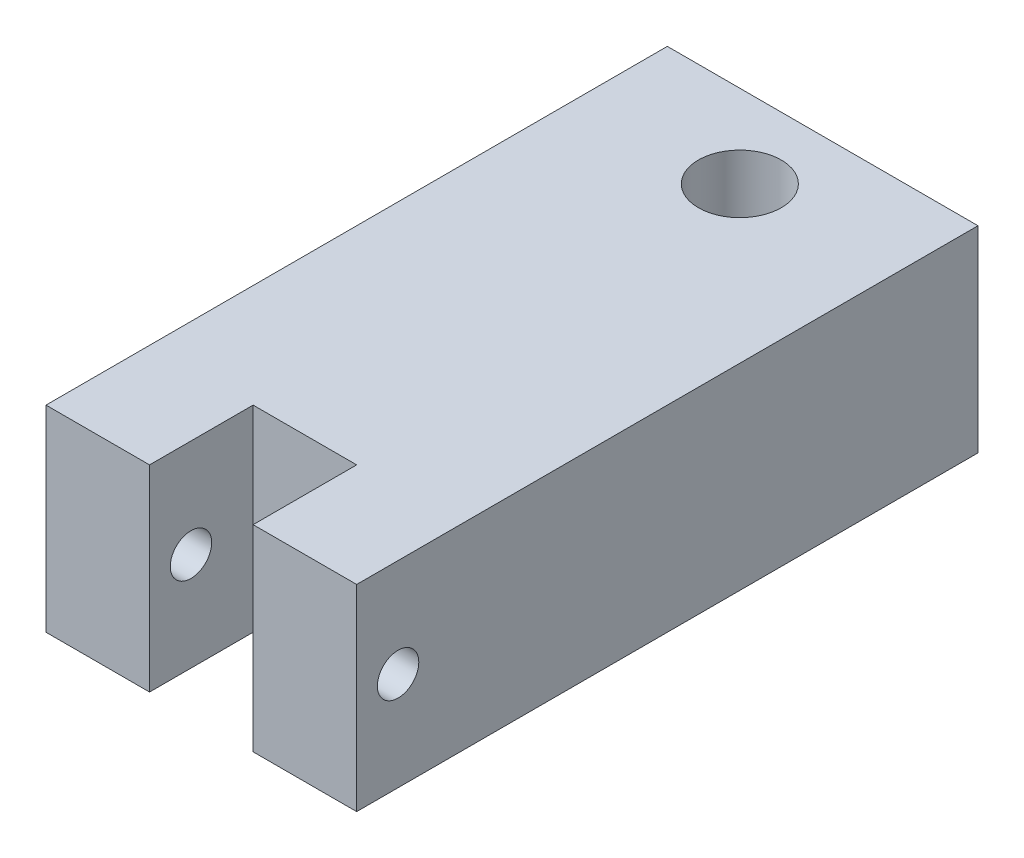
ISO-10303-21;
HEADER;
FILE_DESCRIPTION(('STEP AP214'),'2;1');
FILE_NAME('part.step','',(''),(''),'','','');
FILE_SCHEMA(('AUTOMOTIVE_DESIGN { 1 0 10303 214 1 1 1 1 }'));
ENDSEC;
DATA;
#1=APPLICATION_CONTEXT('core data for automotive mechanical design processes');
#2=APPLICATION_PROTOCOL_DEFINITION('international standard','automotive_design',2000,#1);
#3=PRODUCT_CONTEXT('',#1,'mechanical');
#4=PRODUCT('Part','Part','',(#3));
#5=PRODUCT_RELATED_PRODUCT_CATEGORY('part','',(#4));
#6=PRODUCT_DEFINITION_FORMATION('','',#4);
#7=PRODUCT_DEFINITION_CONTEXT('part definition',#1,'design');
#8=PRODUCT_DEFINITION('design','',#6,#7);
#9=PRODUCT_DEFINITION_SHAPE('','',#8);
#10=(LENGTH_UNIT() NAMED_UNIT(*) SI_UNIT(.MILLI.,.METRE.));
#11=(NAMED_UNIT(*) PLANE_ANGLE_UNIT() SI_UNIT($,.RADIAN.));
#12=(NAMED_UNIT(*) SI_UNIT($,.STERADIAN.) SOLID_ANGLE_UNIT());
#13=UNCERTAINTY_MEASURE_WITH_UNIT(LENGTH_MEASURE(1.E-05),#10,'distance_accuracy_value','');
#14=(GEOMETRIC_REPRESENTATION_CONTEXT(3) GLOBAL_UNCERTAINTY_ASSIGNED_CONTEXT((#13)) GLOBAL_UNIT_ASSIGNED_CONTEXT((#10,
#11,#12)) REPRESENTATION_CONTEXT('',''));
#15=CARTESIAN_POINT('',(0.,0.,0.));
#16=DIRECTION('',(0.,0.,1.));
#17=DIRECTION('',(1.,0.,0.));
#18=AXIS2_PLACEMENT_3D('',#15,#16,#17);
#19=CARTESIAN_POINT('',(22.9996017626033,83.125,157.171618794458));
#20=DIRECTION('',(0.,0.,-1.));
#21=DIRECTION('',(-1.,0.,0.));
#22=AXIS2_PLACEMENT_3D('',#19,#20,#21);
#23=PLANE('',#22);
#24=DIRECTION('',(0.,1.,0.));
#25=VECTOR('',#24,1.);
#26=CARTESIAN_POINT('',(41.7496017626034,83.2189360091688,157.171618794458));
#27=LINE('',#26,#25);
#28=CARTESIAN_POINT('',(41.7496017626034,11.875,157.171618794458));
#29=VERTEX_POINT('',#28);
#30=CARTESIAN_POINT('',(41.7496017626034,83.125,157.171618794458));
#31=VERTEX_POINT('',#30);
#32=EDGE_CURVE('E242',#29,#31,#27,.T.);
#33=ORIENTED_EDGE('',*,*,#32,.F.);
#34=DIRECTION('',(1.,0.,0.));
#35=VECTOR('',#34,1.);
#36=CARTESIAN_POINT('',(22.9996017626033,11.875,157.171618794458));
#37=LINE('',#36,#35);
#38=CARTESIAN_POINT('',(79.2496017626034,11.875,157.171618794458));
#39=VERTEX_POINT('',#38);
#40=EDGE_CURVE('E155',#29,#39,#37,.T.);
#41=ORIENTED_EDGE('',*,*,#40,.T.);
#42=DIRECTION('',(0.,-1.,0.));
#43=VECTOR('',#42,1.);
#44=CARTESIAN_POINT('',(79.2496017626034,83.125,157.171618794458));
#45=LINE('',#44,#43);
#46=CARTESIAN_POINT('',(79.2496017626034,83.125,157.171618794458));
#47=VERTEX_POINT('',#46);
#48=EDGE_CURVE('E13',#47,#39,#45,.T.);
#49=ORIENTED_EDGE('',*,*,#48,.F.);
#50=DIRECTION('',(1.,0.,0.));
#51=VECTOR('',#50,1.);
#52=CARTESIAN_POINT('',(60.4996017626033,83.125,157.171618794458));
#53=LINE('',#52,#51);
#54=EDGE_CURVE('E111',#31,#47,#53,.T.);
#55=ORIENTED_EDGE('',*,*,#54,.F.);
#56=EDGE_LOOP('',(#33,#41,#49,#55));
#57=FACE_BOUND('',#56,.T.);
#58=ADVANCED_FACE('F54',(#57),#23,.F.);
#59=DIRECTION('',(0.,-1.,0.));
#60=VECTOR('',#59,1.);
#61=CARTESIAN_POINT('',(4.24960176260337,83.2189360091688,157.171618794458));
#62=LINE('',#61,#60);
#63=CARTESIAN_POINT('',(4.24960176260337,83.125,157.171618794458));
#64=VERTEX_POINT('',#63);
#65=CARTESIAN_POINT('',(4.24960176260337,11.875,157.171618794458));
#66=VERTEX_POINT('',#65);
#67=EDGE_CURVE('E144',#64,#66,#62,.T.);
#68=ORIENTED_EDGE('',*,*,#67,.F.);
#69=CARTESIAN_POINT('',(-33.2503982373966,83.125,157.171618794458));
#70=VERTEX_POINT('',#69);
#71=EDGE_CURVE('E82',#70,#64,#53,.T.);
#72=ORIENTED_EDGE('',*,*,#71,.F.);
#73=DIRECTION('',(0.,-1.,0.));
#74=VECTOR('',#73,1.);
#75=CARTESIAN_POINT('',(-33.2503982373966,83.125,157.171618794458));
#76=LINE('',#75,#74);
#77=CARTESIAN_POINT('',(-33.2503982373966,11.875,157.171618794458));
#78=VERTEX_POINT('',#77);
#79=EDGE_CURVE('E185',#70,#78,#76,.T.);
#80=ORIENTED_EDGE('',*,*,#79,.T.);
#81=EDGE_CURVE('E101',#78,#66,#37,.T.);
#82=ORIENTED_EDGE('',*,*,#81,.T.);
#83=EDGE_LOOP('',(#68,#72,#80,#82));
#84=FACE_BOUND('',#83,.T.);
#85=ADVANCED_FACE('F224',(#84),#23,.F.);
#86=CARTESIAN_POINT('',(5.74990044065084,11.875,10.1722161505529));
#87=DIRECTION('',(0.,-1.,0.));
#88=DIRECTION('',(0.,0.,-1.));
#89=AXIS2_PLACEMENT_3D('',#86,#87,#88);
#90=PLANE('',#89);
#91=CARTESIAN_POINT('',(22.9996017626034,11.875,-37.8283812055421));
#92=DIRECTION('',(0.,-1.,0.));
#93=DIRECTION('',(0.,0.,-1.));
#94=AXIS2_PLACEMENT_3D('',#91,#92,#93);
#95=CIRCLE('',#94,15.);
#96=CARTESIAN_POINT('',(22.9996017626034,11.875,-52.8283812055421));
#97=VERTEX_POINT('',#96);
#98=EDGE_CURVE('E172',#97,#97,#95,.T.);
#99=ORIENTED_EDGE('',*,*,#98,.F.);
#100=EDGE_LOOP('',(#99));
#101=FACE_BOUND('',#100,.T.);
#102=DIRECTION('',(1.,0.,0.));
#103=VECTOR('',#102,1.);
#104=CARTESIAN_POINT('',(4.24960176260337,11.875,119.671618794458));
#105=LINE('',#104,#103);
#106=CARTESIAN_POINT('',(4.24960176260337,11.875,119.671618794458));
#107=VERTEX_POINT('',#106);
#108=CARTESIAN_POINT('',(41.7496017626034,11.875,119.671618794458));
#109=VERTEX_POINT('',#108);
#110=EDGE_CURVE('E150',#107,#109,#105,.T.);
#111=ORIENTED_EDGE('',*,*,#110,.F.);
#112=DIRECTION('',(0.,0.,1.));
#113=VECTOR('',#112,1.);
#114=CARTESIAN_POINT('',(4.24960176260337,11.875,119.671618794458));
#115=LINE('',#114,#113);
#116=EDGE_CURVE('E74',#107,#66,#115,.T.);
#117=ORIENTED_EDGE('',*,*,#116,.T.);
#118=ORIENTED_EDGE('',*,*,#81,.F.);
#119=DIRECTION('',(0.,0.,1.));
#120=VECTOR('',#119,1.);
#121=CARTESIAN_POINT('',(-33.2503982373967,11.875,-67.828381205542));
#122=LINE('',#121,#120);
#123=CARTESIAN_POINT('',(-33.2503982373967,11.875,-67.828381205542));
#124=VERTEX_POINT('',#123);
#125=EDGE_CURVE('E189',#124,#78,#122,.T.);
#126=ORIENTED_EDGE('',*,*,#125,.F.);
#127=DIRECTION('',(-1.,0.,0.));
#128=VECTOR('',#127,1.);
#129=CARTESIAN_POINT('',(-33.2503982373967,11.875,-67.828381205542));
#130=LINE('',#129,#128);
#131=CARTESIAN_POINT('',(79.2496017626033,11.875,-67.828381205542));
#132=VERTEX_POINT('',#131);
#133=EDGE_CURVE('E187',#132,#124,#130,.T.);
#134=ORIENTED_EDGE('',*,*,#133,.F.);
#135=DIRECTION('',(0.,0.,-1.));
#136=VECTOR('',#135,1.);
#137=CARTESIAN_POINT('',(79.2496017626033,11.875,-67.828381205542));
#138=LINE('',#137,#136);
#139=EDGE_CURVE('E182',#39,#132,#138,.T.);
#140=ORIENTED_EDGE('',*,*,#139,.F.);
#141=ORIENTED_EDGE('',*,*,#40,.F.);
#142=DIRECTION('',(0.,0.,1.));
#143=VECTOR('',#142,1.);
#144=CARTESIAN_POINT('',(41.7496017626034,11.875,119.671618794458));
#145=LINE('',#144,#143);
#146=EDGE_CURVE('E137',#109,#29,#145,.T.);
#147=ORIENTED_EDGE('',*,*,#146,.F.);
#148=EDGE_LOOP('',(#111,#117,#118,#126,#134,#140,#141,#147));
#149=FACE_BOUND('',#148,.T.);
#150=ADVANCED_FACE('F154',(#101,#149),#90,.T.);
#151=CARTESIAN_POINT('',(-115.750398237397,47.5,142.171618794458));
#152=DIRECTION('',(1.,0.,0.));
#153=DIRECTION('',(0.,0.,-1.));
#154=AXIS2_PLACEMENT_3D('',#151,#152,#153);
#155=CYLINDRICAL_SURFACE('',#154,7.50000000000001);
#156=CARTESIAN_POINT('',(41.7496017626034,47.5,142.171618794458));
#157=DIRECTION('',(1.,0.,0.));
#158=DIRECTION('',(0.,1.,0.));
#159=AXIS2_PLACEMENT_3D('',#156,#157,#158);
#160=CIRCLE('',#159,7.50000000000001);
#161=CARTESIAN_POINT('',(41.7496017626034,55.,142.171618794458));
#162=VERTEX_POINT('',#161);
#163=EDGE_CURVE('E56',#162,#162,#160,.F.);
#164=ORIENTED_EDGE('',*,*,#163,.T.);
#165=EDGE_LOOP('',(#164));
#166=FACE_BOUND('',#165,.T.);
#167=CARTESIAN_POINT('',(79.2496017626034,47.5,142.171618794458));
#168=DIRECTION('',(1.,0.,0.));
#169=DIRECTION('',(0.,0.,-1.));
#170=AXIS2_PLACEMENT_3D('',#167,#168,#169);
#171=CIRCLE('',#170,7.50000000000001);
#172=CARTESIAN_POINT('',(79.2496017626034,47.5,134.671618794458));
#173=VERTEX_POINT('',#172);
#174=EDGE_CURVE('E170',#173,#173,#171,.T.);
#175=ORIENTED_EDGE('',*,*,#174,.T.);
#176=EDGE_LOOP('',(#175));
#177=FACE_BOUND('',#176,.T.);
#178=ADVANCED_FACE('F208',(#166,#177),#155,.F.);
#179=CARTESIAN_POINT('',(79.2496017626033,83.125,-67.828381205542));
#180=DIRECTION('',(-1.,0.,0.));
#181=DIRECTION('',(0.,0.,1.));
#182=AXIS2_PLACEMENT_3D('',#179,#180,#181);
#183=PLANE('',#182);
#184=ORIENTED_EDGE('',*,*,#174,.F.);
#185=EDGE_LOOP('',(#184));
#186=FACE_BOUND('',#185,.T.);
#187=ORIENTED_EDGE('',*,*,#139,.T.);
#188=DIRECTION('',(0.,-1.,0.));
#189=VECTOR('',#188,1.);
#190=CARTESIAN_POINT('',(79.2496017626033,83.125,-67.828381205542));
#191=LINE('',#190,#189);
#192=CARTESIAN_POINT('',(79.2496017626033,83.125,-67.828381205542));
#193=VERTEX_POINT('',#192);
#194=EDGE_CURVE('E61',#193,#132,#191,.T.);
#195=ORIENTED_EDGE('',*,*,#194,.F.);
#196=DIRECTION('',(0.,0.,-1.));
#197=VECTOR('',#196,1.);
#198=CARTESIAN_POINT('',(79.2496017626033,83.125,-67.828381205542));
#199=LINE('',#198,#197);
#200=EDGE_CURVE('E176',#47,#193,#199,.T.);
#201=ORIENTED_EDGE('',*,*,#200,.F.);
#202=ORIENTED_EDGE('',*,*,#48,.T.);
#203=EDGE_LOOP('',(#187,#195,#201,#202));
#204=FACE_BOUND('',#203,.T.);
#205=ADVANCED_FACE('F60',(#186,#204),#183,.F.);
#206=CARTESIAN_POINT('',(-33.2503982373967,83.125,-67.828381205542));
#207=DIRECTION('',(0.,0.,1.));
#208=DIRECTION('',(1.,0.,0.));
#209=AXIS2_PLACEMENT_3D('',#206,#207,#208);
#210=PLANE('',#209);
#211=ORIENTED_EDGE('',*,*,#133,.T.);
#212=DIRECTION('',(0.,-1.,0.));
#213=VECTOR('',#212,1.);
#214=CARTESIAN_POINT('',(-33.2503982373967,83.125,-67.828381205542));
#215=LINE('',#214,#213);
#216=CARTESIAN_POINT('',(-33.2503982373967,83.125,-67.828381205542));
#217=VERTEX_POINT('',#216);
#218=EDGE_CURVE('E195',#217,#124,#215,.T.);
#219=ORIENTED_EDGE('',*,*,#218,.F.);
#220=DIRECTION('',(-1.,0.,0.));
#221=VECTOR('',#220,1.);
#222=CARTESIAN_POINT('',(60.4996017626033,83.125,-67.828381205542));
#223=LINE('',#222,#221);
#224=EDGE_CURVE('E178',#193,#217,#223,.T.);
#225=ORIENTED_EDGE('',*,*,#224,.F.);
#226=ORIENTED_EDGE('',*,*,#194,.T.);
#227=EDGE_LOOP('',(#211,#219,#225,#226));
#228=FACE_BOUND('',#227,.T.);
#229=ADVANCED_FACE('F233',(#228),#210,.F.);
#230=CARTESIAN_POINT('',(-33.2503982373967,83.125,-67.828381205542));
#231=DIRECTION('',(1.,0.,0.));
#232=DIRECTION('',(0.,0.,-1.));
#233=AXIS2_PLACEMENT_3D('',#230,#231,#232);
#234=PLANE('',#233);
#235=CARTESIAN_POINT('',(-33.2503982373966,47.5,142.171618794458));
#236=DIRECTION('',(1.,0.,0.));
#237=DIRECTION('',(0.,0.,-1.));
#238=AXIS2_PLACEMENT_3D('',#235,#236,#237);
#239=CIRCLE('',#238,7.50000000000001);
#240=CARTESIAN_POINT('',(-33.2503982373966,47.5,134.671618794458));
#241=VERTEX_POINT('',#240);
#242=EDGE_CURVE('E167',#241,#241,#239,.T.);
#243=ORIENTED_EDGE('',*,*,#242,.T.);
#244=EDGE_LOOP('',(#243));
#245=FACE_BOUND('',#244,.T.);
#246=ORIENTED_EDGE('',*,*,#125,.T.);
#247=ORIENTED_EDGE('',*,*,#79,.F.);
#248=DIRECTION('',(0.,0.,1.));
#249=VECTOR('',#248,1.);
#250=CARTESIAN_POINT('',(-33.2503982373967,83.125,-67.828381205542));
#251=LINE('',#250,#249);
#252=EDGE_CURVE('E179',#217,#70,#251,.T.);
#253=ORIENTED_EDGE('',*,*,#252,.F.);
#254=ORIENTED_EDGE('',*,*,#218,.T.);
#255=EDGE_LOOP('',(#246,#247,#253,#254));
#256=FACE_BOUND('',#255,.T.);
#257=ADVANCED_FACE('F204',(#245,#256),#234,.F.);
#258=CARTESIAN_POINT('',(5.74990044065084,83.125,10.1722161505529));
#259=DIRECTION('',(0.,-1.,0.));
#260=DIRECTION('',(0.,0.,-1.));
#261=AXIS2_PLACEMENT_3D('',#258,#259,#260);
#262=PLANE('',#261);
#263=CARTESIAN_POINT('',(22.9996017626034,83.125,-37.8283812055421));
#264=DIRECTION('',(0.,1.,0.));
#265=DIRECTION('',(0.,0.,1.));
#266=AXIS2_PLACEMENT_3D('',#263,#264,#265);
#267=CIRCLE('',#266,15.);
#268=CARTESIAN_POINT('',(22.9996017626034,83.125,-22.8283812055421));
#269=VERTEX_POINT('',#268);
#270=EDGE_CURVE('E171',#269,#269,#267,.T.);
#271=ORIENTED_EDGE('',*,*,#270,.F.);
#272=EDGE_LOOP('',(#271));
#273=FACE_BOUND('',#272,.T.);
#274=DIRECTION('',(-1.,0.,0.));
#275=VECTOR('',#274,1.);
#276=CARTESIAN_POINT('',(5.74990044065084,83.125,119.671618794458));
#277=LINE('',#276,#275);
#278=CARTESIAN_POINT('',(41.7496017626034,83.125,119.671618794458));
#279=VERTEX_POINT('',#278);
#280=CARTESIAN_POINT('',(4.24960176260337,83.125,119.671618794458));
#281=VERTEX_POINT('',#280);
#282=EDGE_CURVE('E164',#279,#281,#277,.T.);
#283=ORIENTED_EDGE('',*,*,#282,.F.);
#284=DIRECTION('',(0.,0.,1.));
#285=VECTOR('',#284,1.);
#286=CARTESIAN_POINT('',(41.7496017626034,83.125,10.1722161505529));
#287=LINE('',#286,#285);
#288=EDGE_CURVE('E136',#279,#31,#287,.T.);
#289=ORIENTED_EDGE('',*,*,#288,.T.);
#290=ORIENTED_EDGE('',*,*,#54,.T.);
#291=ORIENTED_EDGE('',*,*,#200,.T.);
#292=ORIENTED_EDGE('',*,*,#224,.T.);
#293=ORIENTED_EDGE('',*,*,#252,.T.);
#294=ORIENTED_EDGE('',*,*,#71,.T.);
#295=DIRECTION('',(0.,0.,-1.));
#296=VECTOR('',#295,1.);
#297=CARTESIAN_POINT('',(4.24960176260337,83.125,10.1722161505529));
#298=LINE('',#297,#296);
#299=EDGE_CURVE('E159',#64,#281,#298,.T.);
#300=ORIENTED_EDGE('',*,*,#299,.T.);
#301=EDGE_LOOP('',(#283,#289,#290,#291,#292,#293,#294,#300));
#302=FACE_BOUND('',#301,.T.);
#303=ADVANCED_FACE('F219',(#273,#302),#262,.F.);
#304=CARTESIAN_POINT('',(22.9996017626034,-162.125,-37.8283812055421));
#305=DIRECTION('',(0.,1.,0.));
#306=DIRECTION('',(0.,0.,1.));
#307=AXIS2_PLACEMENT_3D('',#304,#305,#306);
#308=CYLINDRICAL_SURFACE('',#307,15.);
#309=ORIENTED_EDGE('',*,*,#98,.T.);
#310=EDGE_LOOP('',(#309));
#311=FACE_BOUND('',#310,.T.);
#312=ORIENTED_EDGE('',*,*,#270,.T.);
#313=EDGE_LOOP('',(#312));
#314=FACE_BOUND('',#313,.T.);
#315=ADVANCED_FACE('F210',(#311,#314),#308,.F.);
#316=CARTESIAN_POINT('',(4.24960176260338,47.5,142.171618794458));
#317=DIRECTION('',(-1.,0.,0.));
#318=DIRECTION('',(0.,-1.,0.));
#319=AXIS2_PLACEMENT_3D('',#316,#317,#318);
#320=CIRCLE('',#319,7.50000000000001);
#321=CARTESIAN_POINT('',(4.24960176260338,40.,142.171618794458));
#322=VERTEX_POINT('',#321);
#323=EDGE_CURVE('E153',#322,#322,#320,.F.);
#324=ORIENTED_EDGE('',*,*,#323,.T.);
#325=EDGE_LOOP('',(#324));
#326=FACE_BOUND('',#325,.T.);
#327=ORIENTED_EDGE('',*,*,#242,.F.);
#328=EDGE_LOOP('',(#327));
#329=FACE_BOUND('',#328,.T.);
#330=ADVANCED_FACE('F201',(#326,#329),#155,.F.);
#331=CARTESIAN_POINT('',(5.74990044065084,11.875,119.671618794458));
#332=DIRECTION('',(0.,0.,1.));
#333=DIRECTION('',(1.,0.,0.));
#334=AXIS2_PLACEMENT_3D('',#331,#332,#333);
#335=PLANE('',#334);
#336=ORIENTED_EDGE('',*,*,#282,.T.);
#337=DIRECTION('',(0.,-1.,0.));
#338=VECTOR('',#337,1.);
#339=CARTESIAN_POINT('',(4.24960176260337,83.2189360091688,119.671618794458));
#340=LINE('',#339,#338);
#341=EDGE_CURVE('E141',#281,#107,#340,.T.);
#342=ORIENTED_EDGE('',*,*,#341,.T.);
#343=ORIENTED_EDGE('',*,*,#110,.T.);
#344=DIRECTION('',(0.,1.,0.));
#345=VECTOR('',#344,1.);
#346=CARTESIAN_POINT('',(41.7496017626034,83.2189360091688,119.671618794458));
#347=LINE('',#346,#345);
#348=EDGE_CURVE('E133',#109,#279,#347,.T.);
#349=ORIENTED_EDGE('',*,*,#348,.T.);
#350=EDGE_LOOP('',(#336,#342,#343,#349));
#351=FACE_BOUND('',#350,.T.);
#352=ADVANCED_FACE('F149',(#351),#335,.T.);
#353=CARTESIAN_POINT('',(41.7496017626034,83.2189360091688,119.671618794458));
#354=DIRECTION('',(1.,0.,0.));
#355=DIRECTION('',(0.,1.,0.));
#356=AXIS2_PLACEMENT_3D('',#353,#354,#355);
#357=PLANE('',#356);
#358=ORIENTED_EDGE('',*,*,#163,.F.);
#359=EDGE_LOOP('',(#358));
#360=FACE_BOUND('',#359,.T.);
#361=ORIENTED_EDGE('',*,*,#348,.F.);
#362=ORIENTED_EDGE('',*,*,#146,.T.);
#363=ORIENTED_EDGE('',*,*,#32,.T.);
#364=ORIENTED_EDGE('',*,*,#288,.F.);
#365=EDGE_LOOP('',(#361,#362,#363,#364));
#366=FACE_BOUND('',#365,.T.);
#367=ADVANCED_FACE('F138',(#360,#366),#357,.F.);
#368=CARTESIAN_POINT('',(4.24960176260337,83.2189360091688,119.671618794458));
#369=DIRECTION('',(-1.,0.,0.));
#370=DIRECTION('',(0.,-1.,0.));
#371=AXIS2_PLACEMENT_3D('',#368,#369,#370);
#372=PLANE('',#371);
#373=ORIENTED_EDGE('',*,*,#323,.F.);
#374=EDGE_LOOP('',(#373));
#375=FACE_BOUND('',#374,.T.);
#376=ORIENTED_EDGE('',*,*,#67,.T.);
#377=ORIENTED_EDGE('',*,*,#116,.F.);
#378=ORIENTED_EDGE('',*,*,#341,.F.);
#379=ORIENTED_EDGE('',*,*,#299,.F.);
#380=EDGE_LOOP('',(#376,#377,#378,#379));
#381=FACE_BOUND('',#380,.T.);
#382=ADVANCED_FACE('F246',(#375,#381),#372,.F.);
#383=CLOSED_SHELL('',(#58,#85,#150,#178,#205,#229,#257,#303,#315,#330,#352,#367,#382));
#384=MANIFOLD_SOLID_BREP('B2',#383);
#385=ADVANCED_BREP_SHAPE_REPRESENTATION('',(#18,#384),#14);
#386=SHAPE_DEFINITION_REPRESENTATION(#9,#385);
ENDSEC;
END-ISO-10303-21;
